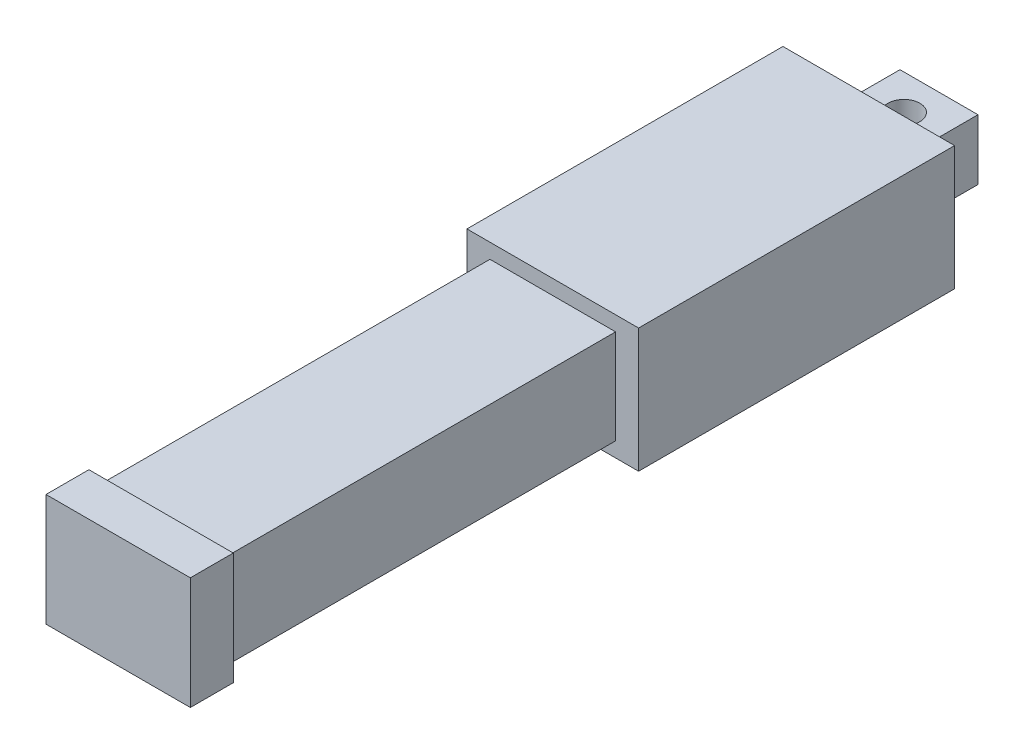
ISO-10303-21;
HEADER;
FILE_DESCRIPTION(('STEP AP214'),'2;1');
FILE_NAME('part.step','',(''),(''),'','','');
FILE_SCHEMA(('AUTOMOTIVE_DESIGN { 1 0 10303 214 1 1 1 1 }'));
ENDSEC;
DATA;
#1=APPLICATION_CONTEXT('core data for automotive mechanical design processes');
#2=APPLICATION_PROTOCOL_DEFINITION('international standard','automotive_design',2000,#1);
#3=PRODUCT_CONTEXT('',#1,'mechanical');
#4=PRODUCT('Part','Part','',(#3));
#5=PRODUCT_RELATED_PRODUCT_CATEGORY('part','',(#4));
#6=PRODUCT_DEFINITION_FORMATION('','',#4);
#7=PRODUCT_DEFINITION_CONTEXT('part definition',#1,'design');
#8=PRODUCT_DEFINITION('design','',#6,#7);
#9=PRODUCT_DEFINITION_SHAPE('','',#8);
#10=(LENGTH_UNIT() NAMED_UNIT(*) SI_UNIT(.MILLI.,.METRE.));
#11=(NAMED_UNIT(*) PLANE_ANGLE_UNIT() SI_UNIT($,.RADIAN.));
#12=(NAMED_UNIT(*) SI_UNIT($,.STERADIAN.) SOLID_ANGLE_UNIT());
#13=UNCERTAINTY_MEASURE_WITH_UNIT(LENGTH_MEASURE(1.E-05),#10,'distance_accuracy_value','');
#14=(GEOMETRIC_REPRESENTATION_CONTEXT(3) GLOBAL_UNCERTAINTY_ASSIGNED_CONTEXT((#13)) GLOBAL_UNIT_ASSIGNED_CONTEXT((#10,
#11,#12)) REPRESENTATION_CONTEXT('',''));
#15=CARTESIAN_POINT('',(0.,0.,0.));
#16=DIRECTION('',(0.,0.,1.));
#17=DIRECTION('',(1.,0.,0.));
#18=AXIS2_PLACEMENT_3D('',#15,#16,#17);
#19=CARTESIAN_POINT('',(0.,-7.95,20.25));
#20=DIRECTION('',(0.,0.,-1.));
#21=DIRECTION('',(-1.,0.,0.));
#22=AXIS2_PLACEMENT_3D('',#19,#20,#21);
#23=PLANE('',#22);
#24=DIRECTION('',(-1.,0.,0.));
#25=VECTOR('',#24,1.);
#26=CARTESIAN_POINT('',(0.,7.95,20.25));
#27=LINE('',#26,#25);
#28=CARTESIAN_POINT('',(11.,7.95,20.25));
#29=VERTEX_POINT('',#28);
#30=CARTESIAN_POINT('',(-11.,7.95,20.25));
#31=VERTEX_POINT('',#30);
#32=EDGE_CURVE('E247',#29,#31,#27,.T.);
#33=ORIENTED_EDGE('',*,*,#32,.T.);
#34=DIRECTION('',(0.,1.,0.));
#35=VECTOR('',#34,1.);
#36=CARTESIAN_POINT('',(-11.,-7.95,20.25));
#37=LINE('',#36,#35);
#38=CARTESIAN_POINT('',(-11.,-7.95,20.25));
#39=VERTEX_POINT('',#38);
#40=EDGE_CURVE('E253',#39,#31,#37,.T.);
#41=ORIENTED_EDGE('',*,*,#40,.F.);
#42=DIRECTION('',(-1.,0.,0.));
#43=VECTOR('',#42,1.);
#44=CARTESIAN_POINT('',(0.,-7.95,20.25));
#45=LINE('',#44,#43);
#46=CARTESIAN_POINT('',(11.,-7.95,20.25));
#47=VERTEX_POINT('',#46);
#48=EDGE_CURVE('E237',#47,#39,#45,.T.);
#49=ORIENTED_EDGE('',*,*,#48,.F.);
#50=DIRECTION('',(0.,1.,0.));
#51=VECTOR('',#50,1.);
#52=CARTESIAN_POINT('',(11.,-7.95,20.25));
#53=LINE('',#52,#51);
#54=EDGE_CURVE('E26',#47,#29,#53,.T.);
#55=ORIENTED_EDGE('',*,*,#54,.T.);
#56=EDGE_LOOP('',(#33,#41,#49,#55));
#57=FACE_BOUND('',#56,.T.);
#58=DIRECTION('',(-1.,0.,0.));
#59=VECTOR('',#58,1.);
#60=CARTESIAN_POINT('',(0.,6.05,20.25));
#61=LINE('',#60,#59);
#62=CARTESIAN_POINT('',(8.05,6.05,20.25));
#63=VERTEX_POINT('',#62);
#64=CARTESIAN_POINT('',(-8.05,6.05,20.25));
#65=VERTEX_POINT('',#64);
#66=EDGE_CURVE('E140',#63,#65,#61,.T.);
#67=ORIENTED_EDGE('',*,*,#66,.F.);
#68=DIRECTION('',(0.,1.,0.));
#69=VECTOR('',#68,1.);
#70=CARTESIAN_POINT('',(8.05,-6.05,20.25));
#71=LINE('',#70,#69);
#72=CARTESIAN_POINT('',(8.05,-6.05,20.25));
#73=VERTEX_POINT('',#72);
#74=EDGE_CURVE('E200',#73,#63,#71,.T.);
#75=ORIENTED_EDGE('',*,*,#74,.F.);
#76=DIRECTION('',(-1.,0.,0.));
#77=VECTOR('',#76,1.);
#78=CARTESIAN_POINT('',(0.,-6.05,20.25));
#79=LINE('',#78,#77);
#80=CARTESIAN_POINT('',(-8.05,-6.05,20.25));
#81=VERTEX_POINT('',#80);
#82=EDGE_CURVE('E174',#73,#81,#79,.T.);
#83=ORIENTED_EDGE('',*,*,#82,.T.);
#84=DIRECTION('',(0.,1.,0.));
#85=VECTOR('',#84,1.);
#86=CARTESIAN_POINT('',(-8.05,-6.05,20.25));
#87=LINE('',#86,#85);
#88=EDGE_CURVE('E184',#81,#65,#87,.T.);
#89=ORIENTED_EDGE('',*,*,#88,.T.);
#90=EDGE_LOOP('',(#67,#75,#83,#89));
#91=FACE_BOUND('',#90,.T.);
#92=ADVANCED_FACE('F17',(#57,#91),#23,.F.);
#93=CARTESIAN_POINT('',(0.,-7.95,-20.25));
#94=DIRECTION('',(0.,0.,-1.));
#95=DIRECTION('',(-1.,0.,0.));
#96=AXIS2_PLACEMENT_3D('',#93,#94,#95);
#97=PLANE('',#96);
#98=DIRECTION('',(1.,0.,0.));
#99=VECTOR('',#98,1.);
#100=CARTESIAN_POINT('',(0.,3.875,-20.25));
#101=LINE('',#100,#99);
#102=CARTESIAN_POINT('',(-5.,3.875,-20.25));
#103=VERTEX_POINT('',#102);
#104=CARTESIAN_POINT('',(5.,3.875,-20.25));
#105=VERTEX_POINT('',#104);
#106=EDGE_CURVE('E202',#103,#105,#101,.T.);
#107=ORIENTED_EDGE('',*,*,#106,.F.);
#108=DIRECTION('',(0.,1.,0.));
#109=VECTOR('',#108,1.);
#110=CARTESIAN_POINT('',(-5.,-3.875,-20.25));
#111=LINE('',#110,#109);
#112=CARTESIAN_POINT('',(-5.,-3.875,-20.25));
#113=VERTEX_POINT('',#112);
#114=EDGE_CURVE('E228',#113,#103,#111,.T.);
#115=ORIENTED_EDGE('',*,*,#114,.F.);
#116=DIRECTION('',(1.,0.,0.));
#117=VECTOR('',#116,1.);
#118=CARTESIAN_POINT('',(0.,-3.875,-20.25));
#119=LINE('',#118,#117);
#120=CARTESIAN_POINT('',(5.,-3.875,-20.25));
#121=VERTEX_POINT('',#120);
#122=EDGE_CURVE('E203',#113,#121,#119,.T.);
#123=ORIENTED_EDGE('',*,*,#122,.T.);
#124=DIRECTION('',(0.,1.,0.));
#125=VECTOR('',#124,1.);
#126=CARTESIAN_POINT('',(5.,-3.875,-20.25));
#127=LINE('',#126,#125);
#128=EDGE_CURVE('E213',#121,#105,#127,.T.);
#129=ORIENTED_EDGE('',*,*,#128,.T.);
#130=EDGE_LOOP('',(#107,#115,#123,#129));
#131=FACE_BOUND('',#130,.T.);
#132=DIRECTION('',(-1.,0.,0.));
#133=VECTOR('',#132,1.);
#134=CARTESIAN_POINT('',(0.,7.95,-20.25));
#135=LINE('',#134,#133);
#136=CARTESIAN_POINT('',(11.,7.95,-20.25));
#137=VERTEX_POINT('',#136);
#138=CARTESIAN_POINT('',(-11.,7.95,-20.25));
#139=VERTEX_POINT('',#138);
#140=EDGE_CURVE('E230',#137,#139,#135,.T.);
#141=ORIENTED_EDGE('',*,*,#140,.F.);
#142=DIRECTION('',(0.,1.,0.));
#143=VECTOR('',#142,1.);
#144=CARTESIAN_POINT('',(11.,-7.95,-20.25));
#145=LINE('',#144,#143);
#146=CARTESIAN_POINT('',(11.,-7.95,-20.25));
#147=VERTEX_POINT('',#146);
#148=EDGE_CURVE('E11',#147,#137,#145,.T.);
#149=ORIENTED_EDGE('',*,*,#148,.F.);
#150=DIRECTION('',(-1.,0.,0.));
#151=VECTOR('',#150,1.);
#152=CARTESIAN_POINT('',(0.,-7.95,-20.25));
#153=LINE('',#152,#151);
#154=CARTESIAN_POINT('',(-11.,-7.95,-20.25));
#155=VERTEX_POINT('',#154);
#156=EDGE_CURVE('E231',#147,#155,#153,.T.);
#157=ORIENTED_EDGE('',*,*,#156,.T.);
#158=DIRECTION('',(0.,1.,0.));
#159=VECTOR('',#158,1.);
#160=CARTESIAN_POINT('',(-11.,-7.95,-20.25));
#161=LINE('',#160,#159);
#162=EDGE_CURVE('E242',#155,#139,#161,.T.);
#163=ORIENTED_EDGE('',*,*,#162,.T.);
#164=EDGE_LOOP('',(#141,#149,#157,#163));
#165=FACE_BOUND('',#164,.T.);
#166=ADVANCED_FACE('F19',(#131,#165),#97,.T.);
#167=CARTESIAN_POINT('',(11.,-7.95,0.));
#168=DIRECTION('',(-1.,0.,0.));
#169=DIRECTION('',(0.,0.,1.));
#170=AXIS2_PLACEMENT_3D('',#167,#168,#169);
#171=PLANE('',#170);
#172=DIRECTION('',(0.,0.,1.));
#173=VECTOR('',#172,1.);
#174=CARTESIAN_POINT('',(11.,7.95,0.));
#175=LINE('',#174,#173);
#176=EDGE_CURVE('E245',#137,#29,#175,.T.);
#177=ORIENTED_EDGE('',*,*,#176,.T.);
#178=ORIENTED_EDGE('',*,*,#54,.F.);
#179=DIRECTION('',(0.,0.,1.));
#180=VECTOR('',#179,1.);
#181=CARTESIAN_POINT('',(11.,-7.95,0.));
#182=LINE('',#181,#180);
#183=EDGE_CURVE('E234',#147,#47,#182,.T.);
#184=ORIENTED_EDGE('',*,*,#183,.F.);
#185=ORIENTED_EDGE('',*,*,#148,.T.);
#186=EDGE_LOOP('',(#177,#178,#184,#185));
#187=FACE_BOUND('',#186,.T.);
#188=ADVANCED_FACE('F275',(#187),#171,.F.);
#189=CARTESIAN_POINT('',(-11.,-7.95,0.));
#190=DIRECTION('',(-1.,0.,0.));
#191=DIRECTION('',(0.,0.,1.));
#192=AXIS2_PLACEMENT_3D('',#189,#190,#191);
#193=PLANE('',#192);
#194=DIRECTION('',(0.,0.,1.));
#195=VECTOR('',#194,1.);
#196=CARTESIAN_POINT('',(-11.,7.95,0.));
#197=LINE('',#196,#195);
#198=EDGE_CURVE('E235',#139,#31,#197,.T.);
#199=ORIENTED_EDGE('',*,*,#198,.F.);
#200=ORIENTED_EDGE('',*,*,#162,.F.);
#201=DIRECTION('',(0.,0.,1.));
#202=VECTOR('',#201,1.);
#203=CARTESIAN_POINT('',(-11.,-7.95,0.));
#204=LINE('',#203,#202);
#205=EDGE_CURVE('E239',#155,#39,#204,.T.);
#206=ORIENTED_EDGE('',*,*,#205,.T.);
#207=ORIENTED_EDGE('',*,*,#40,.T.);
#208=EDGE_LOOP('',(#199,#200,#206,#207));
#209=FACE_BOUND('',#208,.T.);
#210=ADVANCED_FACE('F270',(#209),#193,.T.);
#211=CARTESIAN_POINT('',(0.,-7.95,0.));
#212=DIRECTION('',(0.,-1.,0.));
#213=DIRECTION('',(1.,0.,0.));
#214=AXIS2_PLACEMENT_3D('',#211,#212,#213);
#215=PLANE('',#214);
#216=ORIENTED_EDGE('',*,*,#156,.F.);
#217=ORIENTED_EDGE('',*,*,#183,.T.);
#218=ORIENTED_EDGE('',*,*,#48,.T.);
#219=ORIENTED_EDGE('',*,*,#205,.F.);
#220=EDGE_LOOP('',(#216,#217,#218,#219));
#221=FACE_BOUND('',#220,.T.);
#222=ADVANCED_FACE('F274',(#221),#215,.T.);
#223=CARTESIAN_POINT('',(0.,7.95,0.));
#224=DIRECTION('',(0.,-1.,0.));
#225=DIRECTION('',(1.,0.,0.));
#226=AXIS2_PLACEMENT_3D('',#223,#224,#225);
#227=PLANE('',#226);
#228=ORIENTED_EDGE('',*,*,#140,.T.);
#229=ORIENTED_EDGE('',*,*,#198,.T.);
#230=ORIENTED_EDGE('',*,*,#32,.F.);
#231=ORIENTED_EDGE('',*,*,#176,.F.);
#232=EDGE_LOOP('',(#228,#229,#230,#231));
#233=FACE_BOUND('',#232,.T.);
#234=ADVANCED_FACE('F266',(#233),#227,.F.);
#235=CARTESIAN_POINT('',(-5.,-3.875,-24.75));
#236=DIRECTION('',(1.,0.,0.));
#237=DIRECTION('',(0.,0.,-1.));
#238=AXIS2_PLACEMENT_3D('',#235,#236,#237);
#239=PLANE('',#238);
#240=DIRECTION('',(0.,0.,-1.));
#241=VECTOR('',#240,1.);
#242=CARTESIAN_POINT('',(-5.,3.875,-24.75));
#243=LINE('',#242,#241);
#244=CARTESIAN_POINT('',(-5.,3.875,-29.25));
#245=VERTEX_POINT('',#244);
#246=EDGE_CURVE('E215',#103,#245,#243,.T.);
#247=ORIENTED_EDGE('',*,*,#246,.T.);
#248=DIRECTION('',(0.,1.,0.));
#249=VECTOR('',#248,1.);
#250=CARTESIAN_POINT('',(-5.,-3.875,-29.25));
#251=LINE('',#250,#249);
#252=CARTESIAN_POINT('',(-5.,-3.875,-29.25));
#253=VERTEX_POINT('',#252);
#254=EDGE_CURVE('E225',#253,#245,#251,.T.);
#255=ORIENTED_EDGE('',*,*,#254,.F.);
#256=DIRECTION('',(0.,0.,-1.));
#257=VECTOR('',#256,1.);
#258=CARTESIAN_POINT('',(-5.,-3.875,-24.75));
#259=LINE('',#258,#257);
#260=EDGE_CURVE('E206',#113,#253,#259,.T.);
#261=ORIENTED_EDGE('',*,*,#260,.F.);
#262=ORIENTED_EDGE('',*,*,#114,.T.);
#263=EDGE_LOOP('',(#247,#255,#261,#262));
#264=FACE_BOUND('',#263,.T.);
#265=ADVANCED_FACE('F293',(#264),#239,.F.);
#266=CARTESIAN_POINT('',(0.,-3.875,-29.25));
#267=DIRECTION('',(0.,0.,1.));
#268=DIRECTION('',(1.,0.,0.));
#269=AXIS2_PLACEMENT_3D('',#266,#267,#268);
#270=PLANE('',#269);
#271=DIRECTION('',(1.,0.,0.));
#272=VECTOR('',#271,1.);
#273=CARTESIAN_POINT('',(0.,3.875,-29.25));
#274=LINE('',#273,#272);
#275=CARTESIAN_POINT('',(5.,3.875,-29.25));
#276=VERTEX_POINT('',#275);
#277=EDGE_CURVE('E217',#245,#276,#274,.T.);
#278=ORIENTED_EDGE('',*,*,#277,.T.);
#279=DIRECTION('',(0.,1.,0.));
#280=VECTOR('',#279,1.);
#281=CARTESIAN_POINT('',(5.,-3.875,-29.25));
#282=LINE('',#281,#280);
#283=CARTESIAN_POINT('',(5.,-3.875,-29.25));
#284=VERTEX_POINT('',#283);
#285=EDGE_CURVE('E223',#284,#276,#282,.T.);
#286=ORIENTED_EDGE('',*,*,#285,.F.);
#287=DIRECTION('',(1.,0.,0.));
#288=VECTOR('',#287,1.);
#289=CARTESIAN_POINT('',(0.,-3.875,-29.25));
#290=LINE('',#289,#288);
#291=EDGE_CURVE('E208',#253,#284,#290,.T.);
#292=ORIENTED_EDGE('',*,*,#291,.F.);
#293=ORIENTED_EDGE('',*,*,#254,.T.);
#294=EDGE_LOOP('',(#278,#286,#292,#293));
#295=FACE_BOUND('',#294,.T.);
#296=ADVANCED_FACE('F296',(#295),#270,.F.);
#297=CARTESIAN_POINT('',(5.,-3.875,-24.75));
#298=DIRECTION('',(1.,0.,0.));
#299=DIRECTION('',(0.,0.,-1.));
#300=AXIS2_PLACEMENT_3D('',#297,#298,#299);
#301=PLANE('',#300);
#302=DIRECTION('',(0.,0.,-1.));
#303=VECTOR('',#302,1.);
#304=CARTESIAN_POINT('',(5.,3.875,-24.75));
#305=LINE('',#304,#303);
#306=EDGE_CURVE('E41',#105,#276,#305,.T.);
#307=ORIENTED_EDGE('',*,*,#306,.F.);
#308=ORIENTED_EDGE('',*,*,#128,.F.);
#309=DIRECTION('',(0.,0.,-1.));
#310=VECTOR('',#309,1.);
#311=CARTESIAN_POINT('',(5.,-3.875,-24.75));
#312=LINE('',#311,#310);
#313=EDGE_CURVE('E210',#121,#284,#312,.T.);
#314=ORIENTED_EDGE('',*,*,#313,.T.);
#315=ORIENTED_EDGE('',*,*,#285,.T.);
#316=EDGE_LOOP('',(#307,#308,#314,#315));
#317=FACE_BOUND('',#316,.T.);
#318=ADVANCED_FACE('F302',(#317),#301,.T.);
#319=CARTESIAN_POINT('',(0.,-3.875,-24.75));
#320=DIRECTION('',(0.,-1.,0.));
#321=DIRECTION('',(1.,0.,0.));
#322=AXIS2_PLACEMENT_3D('',#319,#320,#321);
#323=PLANE('',#322);
#324=CARTESIAN_POINT('',(0.,-3.875,-24.75));
#325=DIRECTION('',(0.,-1.,0.));
#326=DIRECTION('',(0.,0.,-1.));
#327=AXIS2_PLACEMENT_3D('',#324,#325,#326);
#328=CIRCLE('',#327,2.05);
#329=CARTESIAN_POINT('',(0.,-3.875,-26.8));
#330=VERTEX_POINT('',#329);
#331=EDGE_CURVE('E160',#330,#330,#328,.T.);
#332=ORIENTED_EDGE('',*,*,#331,.F.);
#333=EDGE_LOOP('',(#332));
#334=FACE_BOUND('',#333,.T.);
#335=ORIENTED_EDGE('',*,*,#122,.F.);
#336=ORIENTED_EDGE('',*,*,#260,.T.);
#337=ORIENTED_EDGE('',*,*,#291,.T.);
#338=ORIENTED_EDGE('',*,*,#313,.F.);
#339=EDGE_LOOP('',(#335,#336,#337,#338));
#340=FACE_BOUND('',#339,.T.);
#341=ADVANCED_FACE('F301',(#334,#340),#323,.T.);
#342=CARTESIAN_POINT('',(0.,3.875,-24.75));
#343=DIRECTION('',(0.,-1.,0.));
#344=DIRECTION('',(1.,0.,0.));
#345=AXIS2_PLACEMENT_3D('',#342,#343,#344);
#346=PLANE('',#345);
#347=CARTESIAN_POINT('',(0.,3.875,-24.75));
#348=DIRECTION('',(0.,-1.,0.));
#349=DIRECTION('',(0.,0.,-1.));
#350=AXIS2_PLACEMENT_3D('',#347,#348,#349);
#351=CIRCLE('',#350,2.05);
#352=CARTESIAN_POINT('',(0.,3.875,-26.8));
#353=VERTEX_POINT('',#352);
#354=EDGE_CURVE('E21',#353,#353,#351,.T.);
#355=ORIENTED_EDGE('',*,*,#354,.T.);
#356=EDGE_LOOP('',(#355));
#357=FACE_BOUND('',#356,.T.);
#358=ORIENTED_EDGE('',*,*,#106,.T.);
#359=ORIENTED_EDGE('',*,*,#306,.T.);
#360=ORIENTED_EDGE('',*,*,#277,.F.);
#361=ORIENTED_EDGE('',*,*,#246,.F.);
#362=EDGE_LOOP('',(#358,#359,#360,#361));
#363=FACE_BOUND('',#362,.T.);
#364=ADVANCED_FACE('F289',(#357,#363),#346,.F.);
#365=CARTESIAN_POINT('',(8.05,-6.05,45.35));
#366=DIRECTION('',(-1.,0.,0.));
#367=DIRECTION('',(0.,0.,1.));
#368=AXIS2_PLACEMENT_3D('',#365,#366,#367);
#369=PLANE('',#368);
#370=DIRECTION('',(0.,0.,1.));
#371=VECTOR('',#370,1.);
#372=CARTESIAN_POINT('',(8.05,6.05,45.35));
#373=LINE('',#372,#371);
#374=CARTESIAN_POINT('',(8.05,6.05,70.45));
#375=VERTEX_POINT('',#374);
#376=EDGE_CURVE('E186',#63,#375,#373,.T.);
#377=ORIENTED_EDGE('',*,*,#376,.T.);
#378=DIRECTION('',(0.,1.,0.));
#379=VECTOR('',#378,1.);
#380=CARTESIAN_POINT('',(8.05,-6.05,70.45));
#381=LINE('',#380,#379);
#382=CARTESIAN_POINT('',(8.05,-6.05,70.45));
#383=VERTEX_POINT('',#382);
#384=EDGE_CURVE('E197',#383,#375,#381,.T.);
#385=ORIENTED_EDGE('',*,*,#384,.F.);
#386=DIRECTION('',(0.,0.,1.));
#387=VECTOR('',#386,1.);
#388=CARTESIAN_POINT('',(8.05,-6.05,45.35));
#389=LINE('',#388,#387);
#390=EDGE_CURVE('E177',#73,#383,#389,.T.);
#391=ORIENTED_EDGE('',*,*,#390,.F.);
#392=ORIENTED_EDGE('',*,*,#74,.T.);
#393=EDGE_LOOP('',(#377,#385,#391,#392));
#394=FACE_BOUND('',#393,.T.);
#395=ADVANCED_FACE('F365',(#394),#369,.F.);
#396=CARTESIAN_POINT('',(-8.05,-6.05,45.35));
#397=DIRECTION('',(-1.,0.,0.));
#398=DIRECTION('',(0.,0.,1.));
#399=AXIS2_PLACEMENT_3D('',#396,#397,#398);
#400=PLANE('',#399);
#401=DIRECTION('',(0.,0.,1.));
#402=VECTOR('',#401,1.);
#403=CARTESIAN_POINT('',(-8.05,6.05,45.35));
#404=LINE('',#403,#402);
#405=CARTESIAN_POINT('',(-8.05,6.05,70.45));
#406=VERTEX_POINT('',#405);
#407=EDGE_CURVE('E33',#65,#406,#404,.T.);
#408=ORIENTED_EDGE('',*,*,#407,.F.);
#409=ORIENTED_EDGE('',*,*,#88,.F.);
#410=DIRECTION('',(0.,0.,1.));
#411=VECTOR('',#410,1.);
#412=CARTESIAN_POINT('',(-8.05,-6.05,45.35));
#413=LINE('',#412,#411);
#414=CARTESIAN_POINT('',(-8.05,-6.05,70.45));
#415=VERTEX_POINT('',#414);
#416=EDGE_CURVE('E181',#81,#415,#413,.T.);
#417=ORIENTED_EDGE('',*,*,#416,.T.);
#418=DIRECTION('',(0.,1.,0.));
#419=VECTOR('',#418,1.);
#420=CARTESIAN_POINT('',(-8.05,-6.05,70.45));
#421=LINE('',#420,#419);
#422=EDGE_CURVE('E195',#415,#406,#421,.T.);
#423=ORIENTED_EDGE('',*,*,#422,.T.);
#424=EDGE_LOOP('',(#408,#409,#417,#423));
#425=FACE_BOUND('',#424,.T.);
#426=ADVANCED_FACE('F374',(#425),#400,.T.);
#427=CARTESIAN_POINT('',(0.,-6.05,45.35));
#428=DIRECTION('',(0.,-1.,0.));
#429=DIRECTION('',(1.,0.,0.));
#430=AXIS2_PLACEMENT_3D('',#427,#428,#429);
#431=PLANE('',#430);
#432=ORIENTED_EDGE('',*,*,#82,.F.);
#433=ORIENTED_EDGE('',*,*,#390,.T.);
#434=DIRECTION('',(-1.,0.,0.));
#435=VECTOR('',#434,1.);
#436=CARTESIAN_POINT('',(0.,-6.05,70.45));
#437=LINE('',#436,#435);
#438=EDGE_CURVE('E179',#383,#415,#437,.T.);
#439=ORIENTED_EDGE('',*,*,#438,.T.);
#440=ORIENTED_EDGE('',*,*,#416,.F.);
#441=EDGE_LOOP('',(#432,#433,#439,#440));
#442=FACE_BOUND('',#441,.T.);
#443=ADVANCED_FACE('F384',(#442),#431,.T.);
#444=CARTESIAN_POINT('',(0.,6.05,45.35));
#445=DIRECTION('',(0.,-1.,0.));
#446=DIRECTION('',(1.,0.,0.));
#447=AXIS2_PLACEMENT_3D('',#444,#445,#446);
#448=PLANE('',#447);
#449=ORIENTED_EDGE('',*,*,#66,.T.);
#450=ORIENTED_EDGE('',*,*,#407,.T.);
#451=DIRECTION('',(-1.,0.,0.));
#452=VECTOR('',#451,1.);
#453=CARTESIAN_POINT('',(0.,6.05,70.45));
#454=LINE('',#453,#452);
#455=EDGE_CURVE('E189',#375,#406,#454,.T.);
#456=ORIENTED_EDGE('',*,*,#455,.F.);
#457=ORIENTED_EDGE('',*,*,#376,.F.);
#458=EDGE_LOOP('',(#449,#450,#456,#457));
#459=FACE_BOUND('',#458,.T.);
#460=ADVANCED_FACE('F393',(#459),#448,.F.);
#461=CARTESIAN_POINT('',(0.,-7.2,70.45));
#462=DIRECTION('',(0.,0.,-1.));
#463=DIRECTION('',(-1.,0.,0.));
#464=AXIS2_PLACEMENT_3D('',#461,#462,#463);
#465=PLANE('',#464);
#466=ORIENTED_EDGE('',*,*,#384,.T.);
#467=ORIENTED_EDGE('',*,*,#455,.T.);
#468=ORIENTED_EDGE('',*,*,#422,.F.);
#469=ORIENTED_EDGE('',*,*,#438,.F.);
#470=EDGE_LOOP('',(#466,#467,#468,#469));
#471=FACE_BOUND('',#470,.T.);
#472=DIRECTION('',(-1.,0.,0.));
#473=VECTOR('',#472,1.);
#474=CARTESIAN_POINT('',(0.,7.2,70.45));
#475=LINE('',#474,#473);
#476=CARTESIAN_POINT('',(9.25,7.2,70.45));
#477=VERTEX_POINT('',#476);
#478=CARTESIAN_POINT('',(-9.25,7.2,70.45));
#479=VERTEX_POINT('',#478);
#480=EDGE_CURVE('E137',#477,#479,#475,.T.);
#481=ORIENTED_EDGE('',*,*,#480,.F.);
#482=DIRECTION('',(0.,1.,0.));
#483=VECTOR('',#482,1.);
#484=CARTESIAN_POINT('',(9.25,-7.2,70.45));
#485=LINE('',#484,#483);
#486=CARTESIAN_POINT('',(9.25,-7.2,70.45));
#487=VERTEX_POINT('',#486);
#488=EDGE_CURVE('E130',#487,#477,#485,.T.);
#489=ORIENTED_EDGE('',*,*,#488,.F.);
#490=DIRECTION('',(-1.,0.,0.));
#491=VECTOR('',#490,1.);
#492=CARTESIAN_POINT('',(0.,-7.2,70.45));
#493=LINE('',#492,#491);
#494=CARTESIAN_POINT('',(-9.25,-7.2,70.45));
#495=VERTEX_POINT('',#494);
#496=EDGE_CURVE('E134',#487,#495,#493,.T.);
#497=ORIENTED_EDGE('',*,*,#496,.T.);
#498=DIRECTION('',(0.,1.,0.));
#499=VECTOR('',#498,1.);
#500=CARTESIAN_POINT('',(-9.25,-7.2,70.45));
#501=LINE('',#500,#499);
#502=EDGE_CURVE('E164',#495,#479,#501,.T.);
#503=ORIENTED_EDGE('',*,*,#502,.T.);
#504=EDGE_LOOP('',(#481,#489,#497,#503));
#505=FACE_BOUND('',#504,.T.);
#506=ADVANCED_FACE('F132',(#471,#505),#465,.T.);
#507=CARTESIAN_POINT('',(9.25,-7.2,73.2));
#508=DIRECTION('',(-1.,0.,0.));
#509=DIRECTION('',(0.,0.,1.));
#510=AXIS2_PLACEMENT_3D('',#507,#508,#509);
#511=PLANE('',#510);
#512=DIRECTION('',(0.,0.,1.));
#513=VECTOR('',#512,1.);
#514=CARTESIAN_POINT('',(9.25,7.2,73.2));
#515=LINE('',#514,#513);
#516=CARTESIAN_POINT('',(9.25,7.2,75.95));
#517=VERTEX_POINT('',#516);
#518=EDGE_CURVE('E166',#477,#517,#515,.T.);
#519=ORIENTED_EDGE('',*,*,#518,.T.);
#520=DIRECTION('',(0.,1.,0.));
#521=VECTOR('',#520,1.);
#522=CARTESIAN_POINT('',(9.25,-7.2,75.95));
#523=LINE('',#522,#521);
#524=CARTESIAN_POINT('',(9.25,-7.2,75.95));
#525=VERTEX_POINT('',#524);
#526=EDGE_CURVE('E141',#525,#517,#523,.T.);
#527=ORIENTED_EDGE('',*,*,#526,.F.);
#528=DIRECTION('',(0.,0.,1.));
#529=VECTOR('',#528,1.);
#530=CARTESIAN_POINT('',(9.25,-7.2,73.2));
#531=LINE('',#530,#529);
#532=EDGE_CURVE('E144',#487,#525,#531,.T.);
#533=ORIENTED_EDGE('',*,*,#532,.F.);
#534=ORIENTED_EDGE('',*,*,#488,.T.);
#535=EDGE_LOOP('',(#519,#527,#533,#534));
#536=FACE_BOUND('',#535,.T.);
#537=ADVANCED_FACE('F145',(#536),#511,.F.);
#538=CARTESIAN_POINT('',(0.,-7.2,75.95));
#539=DIRECTION('',(0.,0.,-1.));
#540=DIRECTION('',(-1.,0.,0.));
#541=AXIS2_PLACEMENT_3D('',#538,#539,#540);
#542=PLANE('',#541);
#543=DIRECTION('',(-1.,0.,0.));
#544=VECTOR('',#543,1.);
#545=CARTESIAN_POINT('',(0.,7.2,75.95));
#546=LINE('',#545,#544);
#547=CARTESIAN_POINT('',(-9.25,7.2,75.95));
#548=VERTEX_POINT('',#547);
#549=EDGE_CURVE('E157',#517,#548,#546,.T.);
#550=ORIENTED_EDGE('',*,*,#549,.T.);
#551=DIRECTION('',(0.,1.,0.));
#552=VECTOR('',#551,1.);
#553=CARTESIAN_POINT('',(-9.25,-7.2,75.95));
#554=LINE('',#553,#552);
#555=CARTESIAN_POINT('',(-9.25,-7.2,75.95));
#556=VERTEX_POINT('',#555);
#557=EDGE_CURVE('E171',#556,#548,#554,.T.);
#558=ORIENTED_EDGE('',*,*,#557,.F.);
#559=DIRECTION('',(-1.,0.,0.));
#560=VECTOR('',#559,1.);
#561=CARTESIAN_POINT('',(0.,-7.2,75.95));
#562=LINE('',#561,#560);
#563=EDGE_CURVE('E149',#525,#556,#562,.T.);
#564=ORIENTED_EDGE('',*,*,#563,.F.);
#565=ORIENTED_EDGE('',*,*,#526,.T.);
#566=EDGE_LOOP('',(#550,#558,#564,#565));
#567=FACE_BOUND('',#566,.T.);
#568=ADVANCED_FACE('F421',(#567),#542,.F.);
#569=CARTESIAN_POINT('',(-9.25,-7.2,73.2));
#570=DIRECTION('',(-1.,0.,0.));
#571=DIRECTION('',(0.,0.,1.));
#572=AXIS2_PLACEMENT_3D('',#569,#570,#571);
#573=PLANE('',#572);
#574=DIRECTION('',(0.,0.,1.));
#575=VECTOR('',#574,1.);
#576=CARTESIAN_POINT('',(-9.25,7.2,73.2));
#577=LINE('',#576,#575);
#578=EDGE_CURVE('E154',#479,#548,#577,.T.);
#579=ORIENTED_EDGE('',*,*,#578,.F.);
#580=ORIENTED_EDGE('',*,*,#502,.F.);
#581=DIRECTION('',(0.,0.,1.));
#582=VECTOR('',#581,1.);
#583=CARTESIAN_POINT('',(-9.25,-7.2,73.2));
#584=LINE('',#583,#582);
#585=EDGE_CURVE('E153',#495,#556,#584,.T.);
#586=ORIENTED_EDGE('',*,*,#585,.T.);
#587=ORIENTED_EDGE('',*,*,#557,.T.);
#588=EDGE_LOOP('',(#579,#580,#586,#587));
#589=FACE_BOUND('',#588,.T.);
#590=ADVANCED_FACE('F430',(#589),#573,.T.);
#591=CARTESIAN_POINT('',(0.,-7.2,73.2));
#592=DIRECTION('',(0.,-1.,0.));
#593=DIRECTION('',(1.,0.,0.));
#594=AXIS2_PLACEMENT_3D('',#591,#592,#593);
#595=PLANE('',#594);
#596=ORIENTED_EDGE('',*,*,#496,.F.);
#597=ORIENTED_EDGE('',*,*,#532,.T.);
#598=ORIENTED_EDGE('',*,*,#563,.T.);
#599=ORIENTED_EDGE('',*,*,#585,.F.);
#600=EDGE_LOOP('',(#596,#597,#598,#599));
#601=FACE_BOUND('',#600,.T.);
#602=ADVANCED_FACE('F151',(#601),#595,.T.);
#603=CARTESIAN_POINT('',(0.,7.2,73.2));
#604=DIRECTION('',(0.,-1.,0.));
#605=DIRECTION('',(1.,0.,0.));
#606=AXIS2_PLACEMENT_3D('',#603,#604,#605);
#607=PLANE('',#606);
#608=ORIENTED_EDGE('',*,*,#480,.T.);
#609=ORIENTED_EDGE('',*,*,#578,.T.);
#610=ORIENTED_EDGE('',*,*,#549,.F.);
#611=ORIENTED_EDGE('',*,*,#518,.F.);
#612=EDGE_LOOP('',(#608,#609,#610,#611));
#613=FACE_BOUND('',#612,.T.);
#614=ADVANCED_FACE('F449',(#613),#607,.F.);
#615=CARTESIAN_POINT('',(0.,104.780524528164,-24.75));
#616=DIRECTION('',(0.,-1.,0.));
#617=DIRECTION('',(0.,0.,-1.));
#618=AXIS2_PLACEMENT_3D('',#615,#616,#617);
#619=CYLINDRICAL_SURFACE('',#618,2.05);
#620=ORIENTED_EDGE('',*,*,#331,.T.);
#621=EDGE_LOOP('',(#620));
#622=FACE_BOUND('',#621,.T.);
#623=ORIENTED_EDGE('',*,*,#354,.F.);
#624=EDGE_LOOP('',(#623));
#625=FACE_BOUND('',#624,.T.);
#626=ADVANCED_FACE('F458',(#622,#625),#619,.F.);
#627=CLOSED_SHELL('',(#92,#166,#188,#210,#222,#234,#265,#296,#318,#341,#364,#395,#426,#443,#460,
#506,#537,#568,#590,#602,#614,#626));
#628=MANIFOLD_SOLID_BREP('B1',#627);
#629=ADVANCED_BREP_SHAPE_REPRESENTATION('',(#18,#628),#14);
#630=SHAPE_DEFINITION_REPRESENTATION(#9,#629);
ENDSEC;
END-ISO-10303-21;
